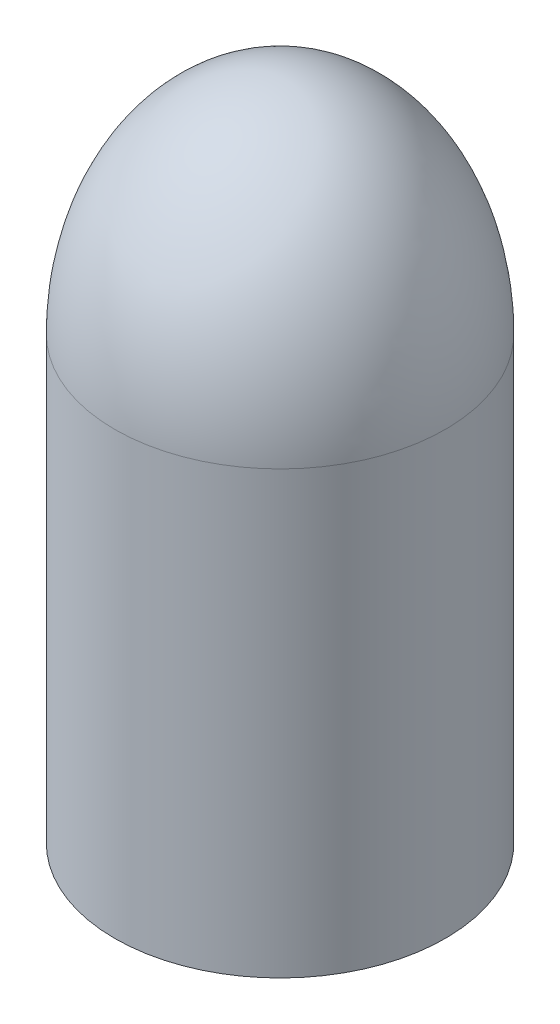
ISO-10303-21;
HEADER;
FILE_DESCRIPTION(('STEP AP214'),'2;1');
FILE_NAME('part.step','',(''),(''),'','','');
FILE_SCHEMA(('AUTOMOTIVE_DESIGN { 1 0 10303 214 1 1 1 1 }'));
ENDSEC;
DATA;
#1=APPLICATION_CONTEXT('core data for automotive mechanical design processes');
#2=APPLICATION_PROTOCOL_DEFINITION('international standard','automotive_design',2000,#1);
#3=PRODUCT_CONTEXT('',#1,'mechanical');
#4=PRODUCT('Part','Part','',(#3));
#5=PRODUCT_RELATED_PRODUCT_CATEGORY('part','',(#4));
#6=PRODUCT_DEFINITION_FORMATION('','',#4);
#7=PRODUCT_DEFINITION_CONTEXT('part definition',#1,'design');
#8=PRODUCT_DEFINITION('design','',#6,#7);
#9=PRODUCT_DEFINITION_SHAPE('','',#8);
#10=(LENGTH_UNIT() NAMED_UNIT(*) SI_UNIT(.MILLI.,.METRE.));
#11=(NAMED_UNIT(*) PLANE_ANGLE_UNIT() SI_UNIT($,.RADIAN.));
#12=(NAMED_UNIT(*) SI_UNIT($,.STERADIAN.) SOLID_ANGLE_UNIT());
#13=UNCERTAINTY_MEASURE_WITH_UNIT(LENGTH_MEASURE(1.E-05),#10,'distance_accuracy_value','');
#14=(GEOMETRIC_REPRESENTATION_CONTEXT(3) GLOBAL_UNCERTAINTY_ASSIGNED_CONTEXT((#13)) GLOBAL_UNIT_ASSIGNED_CONTEXT((#10,
#11,#12)) REPRESENTATION_CONTEXT('',''));
#15=CARTESIAN_POINT('',(0.,0.,0.));
#16=DIRECTION('',(0.,0.,1.));
#17=DIRECTION('',(1.,0.,0.));
#18=AXIS2_PLACEMENT_3D('',#15,#16,#17);
#19=CARTESIAN_POINT('',(0.,4.,0.));
#20=DIRECTION('',(0.,-1.,0.));
#21=DIRECTION('',(0.,0.,-1.));
#22=AXIS2_PLACEMENT_3D('',#19,#20,#21);
#23=CYLINDRICAL_SURFACE('',#22,1.5);
#24=CARTESIAN_POINT('',(0.,4.,0.));
#25=DIRECTION('',(0.,1.,0.));
#26=DIRECTION('',(0.,0.,1.));
#27=AXIS2_PLACEMENT_3D('',#24,#25,#26);
#28=CIRCLE('',#27,1.5);
#29=CARTESIAN_POINT('',(0.,4.,1.5));
#30=VERTEX_POINT('',#29);
#31=EDGE_CURVE('E11',#30,#30,#28,.T.);
#32=ORIENTED_EDGE('',*,*,#31,.F.);
#33=EDGE_LOOP('',(#32));
#34=FACE_BOUND('',#33,.T.);
#35=CARTESIAN_POINT('',(0.,0.,0.));
#36=DIRECTION('',(0.,1.,0.));
#37=DIRECTION('',(0.,0.,1.));
#38=AXIS2_PLACEMENT_3D('',#35,#36,#37);
#39=CIRCLE('',#38,1.5);
#40=CARTESIAN_POINT('',(0.,0.,1.5));
#41=VERTEX_POINT('',#40);
#42=EDGE_CURVE('E40',#41,#41,#39,.T.);
#43=ORIENTED_EDGE('',*,*,#42,.T.);
#44=EDGE_LOOP('',(#43));
#45=FACE_BOUND('',#44,.T.);
#46=ADVANCED_FACE('F32',(#34,#45),#23,.T.);
#47=CARTESIAN_POINT('',(0.,4.,0.));
#48=DIRECTION('',(1.,0.,0.));
#49=DIRECTION('',(0.,1.,0.));
#50=AXIS2_PLACEMENT_3D('',#47,#48,#49);
#51=ELLIPSE('',#50,2.,1.5);
#52=TRIMMED_CURVE('',#51,(PARAMETER_VALUE(0.)),(PARAMETER_VALUE(3.14159265358979)),.T.,.PARAMETER.);
#53=CARTESIAN_POINT('',(0.,2.,0.));
#54=DIRECTION('',(0.,1.,0.));
#55=AXIS1_PLACEMENT('',#53,#54);
#56=SURFACE_OF_REVOLUTION('',#52,#55);
#57=CARTESIAN_POINT('',(0.,6.,0.));
#58=VERTEX_POINT('',#57);
#59=VERTEX_LOOP('',#58);
#60=FACE_BOUND('',#59,.T.);
#61=ORIENTED_EDGE('',*,*,#31,.T.);
#62=EDGE_LOOP('',(#61));
#63=FACE_BOUND('',#62,.T.);
#64=ADVANCED_FACE('F34',(#60,#63),#56,.F.);
#65=CARTESIAN_POINT('',(0.,0.,0.));
#66=DIRECTION('',(0.,1.,0.));
#67=DIRECTION('',(0.,0.,1.));
#68=AXIS2_PLACEMENT_3D('',#65,#66,#67);
#69=PLANE('',#68);
#70=ORIENTED_EDGE('',*,*,#42,.F.);
#71=EDGE_LOOP('',(#70));
#72=FACE_BOUND('',#71,.T.);
#73=ADVANCED_FACE('F45',(#72),#69,.F.);
#74=CLOSED_SHELL('',(#46,#64,#73));
#75=MANIFOLD_SOLID_BREP('B2',#74);
#76=ADVANCED_BREP_SHAPE_REPRESENTATION('',(#18,#75),#14);
#77=SHAPE_DEFINITION_REPRESENTATION(#9,#76);
ENDSEC;
END-ISO-10303-21;
